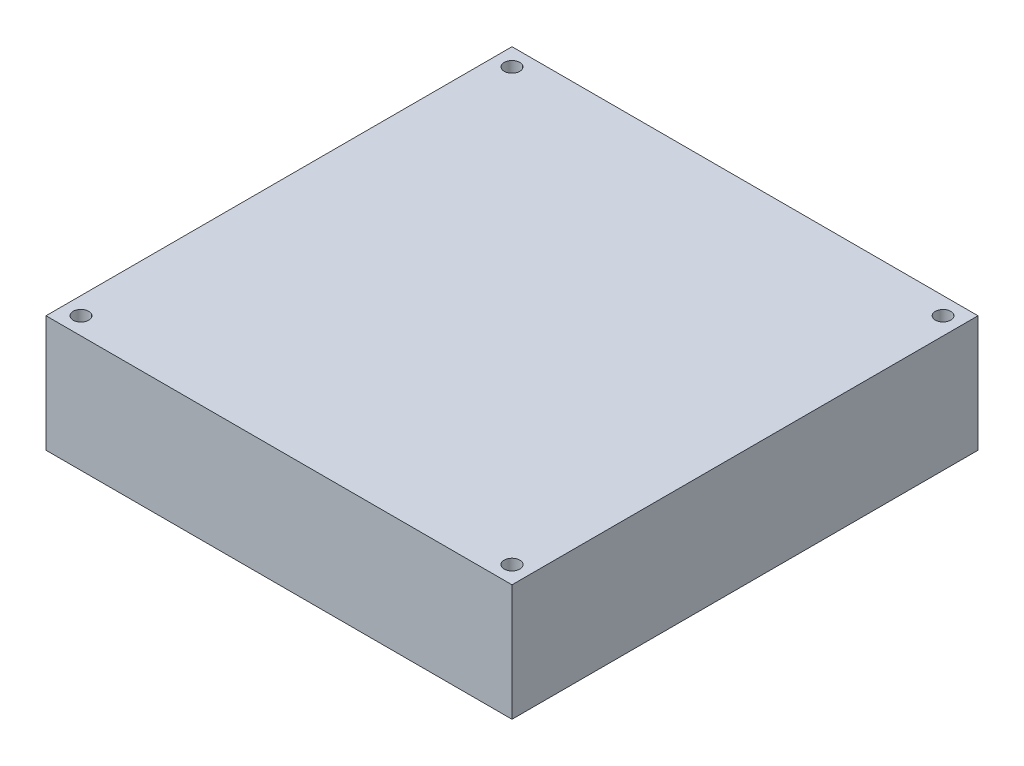
ISO-10303-21;
HEADER;
FILE_DESCRIPTION(('STEP AP214'),'2;1');
FILE_NAME('part.step','',(''),(''),'','','');
FILE_SCHEMA(('AUTOMOTIVE_DESIGN { 1 0 10303 214 1 1 1 1 }'));
ENDSEC;
DATA;
#1=APPLICATION_CONTEXT('core data for automotive mechanical design processes');
#2=APPLICATION_PROTOCOL_DEFINITION('international standard','automotive_design',2000,#1);
#3=PRODUCT_CONTEXT('',#1,'mechanical');
#4=PRODUCT('Part','Part','',(#3));
#5=PRODUCT_RELATED_PRODUCT_CATEGORY('part','',(#4));
#6=PRODUCT_DEFINITION_FORMATION('','',#4);
#7=PRODUCT_DEFINITION_CONTEXT('part definition',#1,'design');
#8=PRODUCT_DEFINITION('design','',#6,#7);
#9=PRODUCT_DEFINITION_SHAPE('','',#8);
#10=(LENGTH_UNIT() NAMED_UNIT(*) SI_UNIT(.MILLI.,.METRE.));
#11=(NAMED_UNIT(*) PLANE_ANGLE_UNIT() SI_UNIT($,.RADIAN.));
#12=(NAMED_UNIT(*) SI_UNIT($,.STERADIAN.) SOLID_ANGLE_UNIT());
#13=UNCERTAINTY_MEASURE_WITH_UNIT(LENGTH_MEASURE(1.E-05),#10,'distance_accuracy_value','');
#14=(GEOMETRIC_REPRESENTATION_CONTEXT(3) GLOBAL_UNCERTAINTY_ASSIGNED_CONTEXT((#13)) GLOBAL_UNIT_ASSIGNED_CONTEXT((#10,
#11,#12)) REPRESENTATION_CONTEXT('',''));
#15=CARTESIAN_POINT('',(0.,0.,0.));
#16=DIRECTION('',(0.,0.,1.));
#17=DIRECTION('',(1.,0.,0.));
#18=AXIS2_PLACEMENT_3D('',#15,#16,#17);
#19=CARTESIAN_POINT('',(0.,15.,0.));
#20=DIRECTION('',(-1.,0.,0.));
#21=DIRECTION('',(0.,0.,1.));
#22=AXIS2_PLACEMENT_3D('',#19,#20,#21);
#23=PLANE('',#22);
#24=DIRECTION('',(0.,0.,-1.));
#25=VECTOR('',#24,1.);
#26=CARTESIAN_POINT('',(0.,0.,0.));
#27=LINE('',#26,#25);
#28=CARTESIAN_POINT('',(0.,0.,0.));
#29=VERTEX_POINT('',#28);
#30=CARTESIAN_POINT('',(0.,0.,-60.));
#31=VERTEX_POINT('',#30);
#32=EDGE_CURVE('E98',#29,#31,#27,.T.);
#33=ORIENTED_EDGE('',*,*,#32,.T.);
#34=DIRECTION('',(0.,-1.,0.));
#35=VECTOR('',#34,1.);
#36=CARTESIAN_POINT('',(0.,15.,-60.));
#37=LINE('',#36,#35);
#38=CARTESIAN_POINT('',(0.,15.,-60.));
#39=VERTEX_POINT('',#38);
#40=EDGE_CURVE('E11',#39,#31,#37,.T.);
#41=ORIENTED_EDGE('',*,*,#40,.F.);
#42=DIRECTION('',(0.,0.,-1.));
#43=VECTOR('',#42,1.);
#44=CARTESIAN_POINT('',(0.,15.,0.));
#45=LINE('',#44,#43);
#46=CARTESIAN_POINT('',(0.,15.,0.));
#47=VERTEX_POINT('',#46);
#48=EDGE_CURVE('E86',#47,#39,#45,.T.);
#49=ORIENTED_EDGE('',*,*,#48,.F.);
#50=DIRECTION('',(0.,-1.,0.));
#51=VECTOR('',#50,1.);
#52=CARTESIAN_POINT('',(0.,15.,0.));
#53=LINE('',#52,#51);
#54=EDGE_CURVE('E94',#47,#29,#53,.T.);
#55=ORIENTED_EDGE('',*,*,#54,.T.);
#56=EDGE_LOOP('',(#33,#41,#49,#55));
#57=FACE_BOUND('',#56,.T.);
#58=ADVANCED_FACE('F35',(#57),#23,.F.);
#59=CARTESIAN_POINT('',(0.,15.,-60.));
#60=DIRECTION('',(0.,0.,1.));
#61=DIRECTION('',(1.,0.,0.));
#62=AXIS2_PLACEMENT_3D('',#59,#60,#61);
#63=PLANE('',#62);
#64=DIRECTION('',(-1.,0.,0.));
#65=VECTOR('',#64,1.);
#66=CARTESIAN_POINT('',(0.,0.,-60.));
#67=LINE('',#66,#65);
#68=CARTESIAN_POINT('',(-60.,0.,-60.));
#69=VERTEX_POINT('',#68);
#70=EDGE_CURVE('E90',#31,#69,#67,.T.);
#71=ORIENTED_EDGE('',*,*,#70,.T.);
#72=DIRECTION('',(0.,-1.,0.));
#73=VECTOR('',#72,1.);
#74=CARTESIAN_POINT('',(-60.,15.,-60.));
#75=LINE('',#74,#73);
#76=CARTESIAN_POINT('',(-60.,15.,-60.));
#77=VERTEX_POINT('',#76);
#78=EDGE_CURVE('E43',#77,#69,#75,.T.);
#79=ORIENTED_EDGE('',*,*,#78,.F.);
#80=DIRECTION('',(-1.,0.,0.));
#81=VECTOR('',#80,1.);
#82=CARTESIAN_POINT('',(0.,15.,-60.));
#83=LINE('',#82,#81);
#84=EDGE_CURVE('E81',#39,#77,#83,.T.);
#85=ORIENTED_EDGE('',*,*,#84,.F.);
#86=ORIENTED_EDGE('',*,*,#40,.T.);
#87=EDGE_LOOP('',(#71,#79,#85,#86));
#88=FACE_BOUND('',#87,.T.);
#89=ADVANCED_FACE('F89',(#88),#63,.F.);
#90=CARTESIAN_POINT('',(-60.,15.,0.));
#91=DIRECTION('',(1.,0.,0.));
#92=DIRECTION('',(0.,0.,-1.));
#93=AXIS2_PLACEMENT_3D('',#90,#91,#92);
#94=PLANE('',#93);
#95=DIRECTION('',(0.,0.,1.));
#96=VECTOR('',#95,1.);
#97=CARTESIAN_POINT('',(-60.,0.,0.));
#98=LINE('',#97,#96);
#99=CARTESIAN_POINT('',(-60.,0.,0.));
#100=VERTEX_POINT('',#99);
#101=EDGE_CURVE('E68',#69,#100,#98,.T.);
#102=ORIENTED_EDGE('',*,*,#101,.T.);
#103=DIRECTION('',(0.,-1.,0.));
#104=VECTOR('',#103,1.);
#105=CARTESIAN_POINT('',(-60.,15.,0.));
#106=LINE('',#105,#104);
#107=CARTESIAN_POINT('',(-60.,15.,0.));
#108=VERTEX_POINT('',#107);
#109=EDGE_CURVE('E91',#108,#100,#106,.T.);
#110=ORIENTED_EDGE('',*,*,#109,.F.);
#111=DIRECTION('',(0.,0.,1.));
#112=VECTOR('',#111,1.);
#113=CARTESIAN_POINT('',(-60.,15.,0.));
#114=LINE('',#113,#112);
#115=EDGE_CURVE('E84',#77,#108,#114,.T.);
#116=ORIENTED_EDGE('',*,*,#115,.F.);
#117=ORIENTED_EDGE('',*,*,#78,.T.);
#118=EDGE_LOOP('',(#102,#110,#116,#117));
#119=FACE_BOUND('',#118,.T.);
#120=ADVANCED_FACE('F92',(#119),#94,.F.);
#121=CARTESIAN_POINT('',(0.,15.,0.));
#122=DIRECTION('',(0.,0.,-1.));
#123=DIRECTION('',(-1.,0.,0.));
#124=AXIS2_PLACEMENT_3D('',#121,#122,#123);
#125=PLANE('',#124);
#126=DIRECTION('',(1.,0.,0.));
#127=VECTOR('',#126,1.);
#128=CARTESIAN_POINT('',(0.,0.,0.));
#129=LINE('',#128,#127);
#130=EDGE_CURVE('E74',#100,#29,#129,.T.);
#131=ORIENTED_EDGE('',*,*,#130,.T.);
#132=ORIENTED_EDGE('',*,*,#54,.F.);
#133=DIRECTION('',(1.,0.,0.));
#134=VECTOR('',#133,1.);
#135=CARTESIAN_POINT('',(0.,15.,0.));
#136=LINE('',#135,#134);
#137=EDGE_CURVE('E51',#108,#47,#136,.T.);
#138=ORIENTED_EDGE('',*,*,#137,.F.);
#139=ORIENTED_EDGE('',*,*,#109,.T.);
#140=EDGE_LOOP('',(#131,#132,#138,#139));
#141=FACE_BOUND('',#140,.T.);
#142=ADVANCED_FACE('F106',(#141),#125,.F.);
#143=CARTESIAN_POINT('',(0.,15.,0.));
#144=DIRECTION('',(0.,1.,0.));
#145=DIRECTION('',(0.,0.,1.));
#146=AXIS2_PLACEMENT_3D('',#143,#144,#145);
#147=PLANE('',#146);
#148=CARTESIAN_POINT('',(-2.25000000000001,15.,-2.24999999999999));
#149=DIRECTION('',(0.,1.,0.));
#150=DIRECTION('',(0.,0.,1.));
#151=AXIS2_PLACEMENT_3D('',#148,#149,#150);
#152=CIRCLE('',#151,1.0089584502369);
#153=CARTESIAN_POINT('',(-2.25000000000001,15.,-1.24104154976309));
#154=VERTEX_POINT('',#153);
#155=EDGE_CURVE('E118',#154,#154,#152,.T.);
#156=ORIENTED_EDGE('',*,*,#155,.F.);
#157=EDGE_LOOP('',(#156));
#158=FACE_BOUND('',#157,.T.);
#159=CARTESIAN_POINT('',(-2.25000000000001,15.,-57.75));
#160=DIRECTION('',(0.,1.,0.));
#161=DIRECTION('',(0.,0.,1.));
#162=AXIS2_PLACEMENT_3D('',#159,#160,#161);
#163=CIRCLE('',#162,0.990882211158784);
#164=CARTESIAN_POINT('',(-2.25000000000001,15.,-56.7591177888412));
#165=VERTEX_POINT('',#164);
#166=EDGE_CURVE('E124',#165,#165,#163,.T.);
#167=ORIENTED_EDGE('',*,*,#166,.F.);
#168=EDGE_LOOP('',(#167));
#169=FACE_BOUND('',#168,.T.);
#170=CARTESIAN_POINT('',(-57.75,15.,-57.75));
#171=DIRECTION('',(0.,1.,0.));
#172=DIRECTION('',(0.,0.,1.));
#173=AXIS2_PLACEMENT_3D('',#170,#171,#172);
#174=CIRCLE('',#173,1.00320536308589);
#175=CARTESIAN_POINT('',(-57.75,15.,-56.7467946369141));
#176=VERTEX_POINT('',#175);
#177=EDGE_CURVE('E130',#176,#176,#174,.T.);
#178=ORIENTED_EDGE('',*,*,#177,.F.);
#179=EDGE_LOOP('',(#178));
#180=FACE_BOUND('',#179,.T.);
#181=CARTESIAN_POINT('',(-57.75,15.,-2.24999999999999));
#182=DIRECTION('',(0.,1.,0.));
#183=DIRECTION('',(0.,0.,1.));
#184=AXIS2_PLACEMENT_3D('',#181,#182,#183);
#185=CIRCLE('',#184,1.00168644675863);
#186=CARTESIAN_POINT('',(-57.75,15.,-1.24831355324136));
#187=VERTEX_POINT('',#186);
#188=EDGE_CURVE('E112',#187,#187,#185,.T.);
#189=ORIENTED_EDGE('',*,*,#188,.F.);
#190=EDGE_LOOP('',(#189));
#191=FACE_BOUND('',#190,.T.);
#192=ORIENTED_EDGE('',*,*,#48,.T.);
#193=ORIENTED_EDGE('',*,*,#84,.T.);
#194=ORIENTED_EDGE('',*,*,#115,.T.);
#195=ORIENTED_EDGE('',*,*,#137,.T.);
#196=EDGE_LOOP('',(#192,#193,#194,#195));
#197=FACE_BOUND('',#196,.T.);
#198=ADVANCED_FACE('F82',(#158,#169,#180,#191,#197),#147,.T.);
#199=CARTESIAN_POINT('',(0.,0.,0.));
#200=DIRECTION('',(0.,1.,0.));
#201=DIRECTION('',(0.,0.,1.));
#202=AXIS2_PLACEMENT_3D('',#199,#200,#201);
#203=PLANE('',#202);
#204=CARTESIAN_POINT('',(-2.25000000000001,0.,-2.24999999999999));
#205=DIRECTION('',(0.,1.,0.));
#206=DIRECTION('',(0.,0.,1.));
#207=AXIS2_PLACEMENT_3D('',#204,#205,#206);
#208=CIRCLE('',#207,1.0089584502369);
#209=CARTESIAN_POINT('',(-2.25000000000001,0.,-1.24104154976309));
#210=VERTEX_POINT('',#209);
#211=EDGE_CURVE('E121',#210,#210,#208,.T.);
#212=ORIENTED_EDGE('',*,*,#211,.T.);
#213=EDGE_LOOP('',(#212));
#214=FACE_BOUND('',#213,.T.);
#215=CARTESIAN_POINT('',(-2.25000000000001,0.,-57.75));
#216=DIRECTION('',(0.,1.,0.));
#217=DIRECTION('',(0.,0.,1.));
#218=AXIS2_PLACEMENT_3D('',#215,#216,#217);
#219=CIRCLE('',#218,0.990882211158784);
#220=CARTESIAN_POINT('',(-2.25000000000001,0.,-56.7591177888412));
#221=VERTEX_POINT('',#220);
#222=EDGE_CURVE('E127',#221,#221,#219,.T.);
#223=ORIENTED_EDGE('',*,*,#222,.T.);
#224=EDGE_LOOP('',(#223));
#225=FACE_BOUND('',#224,.T.);
#226=CARTESIAN_POINT('',(-57.75,0.,-57.75));
#227=DIRECTION('',(0.,1.,0.));
#228=DIRECTION('',(0.,0.,1.));
#229=AXIS2_PLACEMENT_3D('',#226,#227,#228);
#230=CIRCLE('',#229,1.00320536308589);
#231=CARTESIAN_POINT('',(-57.75,0.,-56.7467946369141));
#232=VERTEX_POINT('',#231);
#233=EDGE_CURVE('E115',#232,#232,#230,.T.);
#234=ORIENTED_EDGE('',*,*,#233,.T.);
#235=EDGE_LOOP('',(#234));
#236=FACE_BOUND('',#235,.T.);
#237=CARTESIAN_POINT('',(-57.75,0.,-2.24999999999999));
#238=DIRECTION('',(0.,1.,0.));
#239=DIRECTION('',(0.,0.,1.));
#240=AXIS2_PLACEMENT_3D('',#237,#238,#239);
#241=CIRCLE('',#240,1.00168644675863);
#242=CARTESIAN_POINT('',(-57.75,0.,-1.24831355324136));
#243=VERTEX_POINT('',#242);
#244=EDGE_CURVE('E101',#243,#243,#241,.T.);
#245=ORIENTED_EDGE('',*,*,#244,.T.);
#246=EDGE_LOOP('',(#245));
#247=FACE_BOUND('',#246,.T.);
#248=ORIENTED_EDGE('',*,*,#32,.F.);
#249=ORIENTED_EDGE('',*,*,#130,.F.);
#250=ORIENTED_EDGE('',*,*,#101,.F.);
#251=ORIENTED_EDGE('',*,*,#70,.F.);
#252=EDGE_LOOP('',(#248,#249,#250,#251));
#253=FACE_BOUND('',#252,.T.);
#254=ADVANCED_FACE('F109',(#214,#225,#236,#247,#253),#203,.F.);
#255=CARTESIAN_POINT('',(-57.75,0.,-2.24999999999999));
#256=DIRECTION('',(0.,1.,0.));
#257=DIRECTION('',(0.,0.,1.));
#258=AXIS2_PLACEMENT_3D('',#255,#256,#257);
#259=CYLINDRICAL_SURFACE('',#258,1.00168644675863);
#260=ORIENTED_EDGE('',*,*,#244,.F.);
#261=EDGE_LOOP('',(#260));
#262=FACE_BOUND('',#261,.T.);
#263=ORIENTED_EDGE('',*,*,#188,.T.);
#264=EDGE_LOOP('',(#263));
#265=FACE_BOUND('',#264,.T.);
#266=ADVANCED_FACE('F142',(#262,#265),#259,.F.);
#267=CARTESIAN_POINT('',(-57.75,0.,-57.75));
#268=DIRECTION('',(0.,1.,0.));
#269=DIRECTION('',(0.,0.,1.));
#270=AXIS2_PLACEMENT_3D('',#267,#268,#269);
#271=CYLINDRICAL_SURFACE('',#270,1.00320536308589);
#272=ORIENTED_EDGE('',*,*,#233,.F.);
#273=EDGE_LOOP('',(#272));
#274=FACE_BOUND('',#273,.T.);
#275=ORIENTED_EDGE('',*,*,#177,.T.);
#276=EDGE_LOOP('',(#275));
#277=FACE_BOUND('',#276,.T.);
#278=ADVANCED_FACE('F138',(#274,#277),#271,.F.);
#279=CARTESIAN_POINT('',(-2.25000000000001,0.,-57.75));
#280=DIRECTION('',(0.,1.,0.));
#281=DIRECTION('',(0.,0.,1.));
#282=AXIS2_PLACEMENT_3D('',#279,#280,#281);
#283=CYLINDRICAL_SURFACE('',#282,0.990882211158784);
#284=ORIENTED_EDGE('',*,*,#222,.F.);
#285=EDGE_LOOP('',(#284));
#286=FACE_BOUND('',#285,.T.);
#287=ORIENTED_EDGE('',*,*,#166,.T.);
#288=EDGE_LOOP('',(#287));
#289=FACE_BOUND('',#288,.T.);
#290=ADVANCED_FACE('F141',(#286,#289),#283,.F.);
#291=CARTESIAN_POINT('',(-2.25000000000001,0.,-2.24999999999999));
#292=DIRECTION('',(0.,1.,0.));
#293=DIRECTION('',(0.,0.,1.));
#294=AXIS2_PLACEMENT_3D('',#291,#292,#293);
#295=CYLINDRICAL_SURFACE('',#294,1.0089584502369);
#296=ORIENTED_EDGE('',*,*,#211,.F.);
#297=EDGE_LOOP('',(#296));
#298=FACE_BOUND('',#297,.T.);
#299=ORIENTED_EDGE('',*,*,#155,.T.);
#300=EDGE_LOOP('',(#299));
#301=FACE_BOUND('',#300,.T.);
#302=ADVANCED_FACE('F203',(#298,#301),#295,.F.);
#303=CLOSED_SHELL('',(#58,#89,#120,#142,#198,#254,#266,#278,#290,#302));
#304=MANIFOLD_SOLID_BREP('B2',#303);
#305=ADVANCED_BREP_SHAPE_REPRESENTATION('',(#18,#304),#14);
#306=SHAPE_DEFINITION_REPRESENTATION(#9,#305);
ENDSEC;
END-ISO-10303-21;
